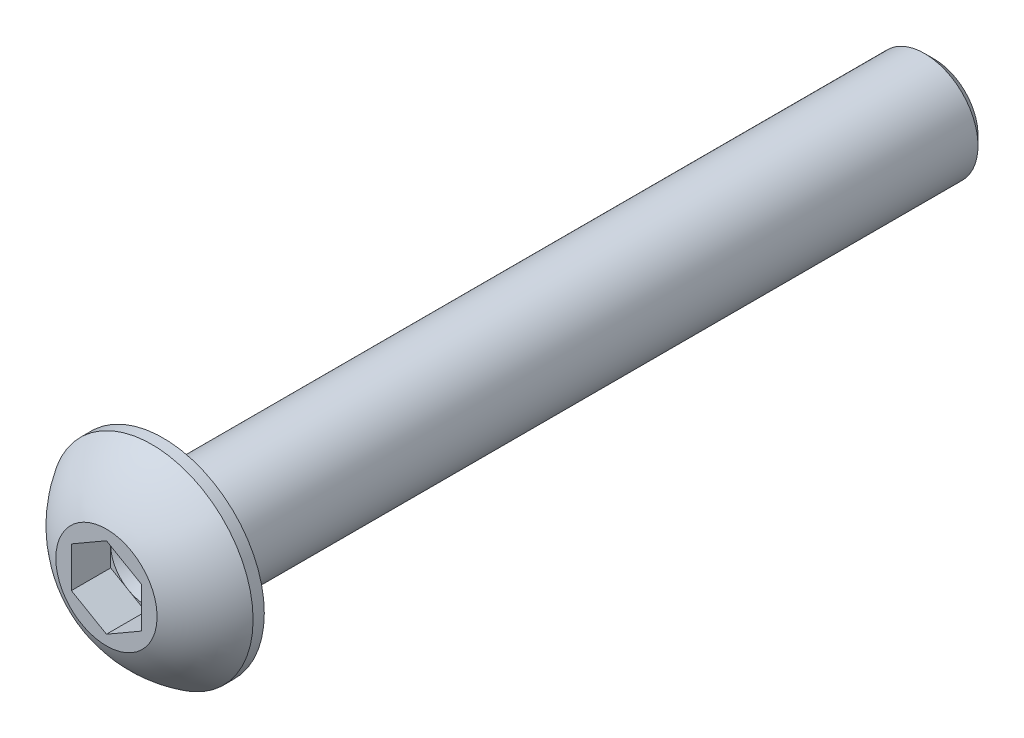
ISO-10303-21;
HEADER;
FILE_DESCRIPTION(('STEP AP214'),'2;1');
FILE_NAME('part.step','',(''),(''),'','','');
FILE_SCHEMA(('AUTOMOTIVE_DESIGN { 1 0 10303 214 1 1 1 1 }'));
ENDSEC;
DATA;
#1=APPLICATION_CONTEXT('core data for automotive mechanical design processes');
#2=APPLICATION_PROTOCOL_DEFINITION('international standard','automotive_design',2000,#1);
#3=PRODUCT_CONTEXT('',#1,'mechanical');
#4=PRODUCT('Part','Part','',(#3));
#5=PRODUCT_RELATED_PRODUCT_CATEGORY('part','',(#4));
#6=PRODUCT_DEFINITION_FORMATION('','',#4);
#7=PRODUCT_DEFINITION_CONTEXT('part definition',#1,'design');
#8=PRODUCT_DEFINITION('design','',#6,#7);
#9=PRODUCT_DEFINITION_SHAPE('','',#8);
#10=(LENGTH_UNIT() NAMED_UNIT(*) SI_UNIT(.MILLI.,.METRE.));
#11=(NAMED_UNIT(*) PLANE_ANGLE_UNIT() SI_UNIT($,.RADIAN.));
#12=(NAMED_UNIT(*) SI_UNIT($,.STERADIAN.) SOLID_ANGLE_UNIT());
#13=UNCERTAINTY_MEASURE_WITH_UNIT(LENGTH_MEASURE(1.E-05),#10,'distance_accuracy_value','');
#14=(GEOMETRIC_REPRESENTATION_CONTEXT(3) GLOBAL_UNCERTAINTY_ASSIGNED_CONTEXT((#13)) GLOBAL_UNIT_ASSIGNED_CONTEXT((#10,
#11,#12)) REPRESENTATION_CONTEXT('',''));
#15=CARTESIAN_POINT('',(0.,0.,0.));
#16=DIRECTION('',(0.,0.,1.));
#17=DIRECTION('',(1.,0.,0.));
#18=AXIS2_PLACEMENT_3D('',#15,#16,#17);
#19=CARTESIAN_POINT('',(0.,0.,-1.778));
#20=DIRECTION('',(0.,0.,1.));
#21=DIRECTION('',(1.,0.,0.));
#22=AXIS2_PLACEMENT_3D('',#19,#20,#21);
#23=PLANE('',#22);
#24=CARTESIAN_POINT('',(0.,0.,-1.778));
#25=DIRECTION('',(0.,0.,1.));
#26=DIRECTION('',(1.,0.,0.));
#27=AXIS2_PLACEMENT_3D('',#24,#25,#26);
#28=CIRCLE('',#27,1.5875);
#29=CARTESIAN_POINT('',(1.5875,0.,-1.778));
#30=VERTEX_POINT('',#29);
#31=CARTESIAN_POINT('',(0.79375,1.3748153285078,-1.778));
#32=VERTEX_POINT('',#31);
#33=EDGE_CURVE('E96',#30,#32,#28,.T.);
#34=ORIENTED_EDGE('',*,*,#33,.F.);
#35=DIRECTION('',(0.,-1.,0.));
#36=VECTOR('',#35,1.);
#37=CARTESIAN_POINT('',(1.5875,0.,-1.778));
#38=LINE('',#37,#36);
#39=CARTESIAN_POINT('',(1.5875,0.916543552338531,-1.778));
#40=VERTEX_POINT('',#39);
#41=EDGE_CURVE('E120',#40,#30,#38,.T.);
#42=ORIENTED_EDGE('',*,*,#41,.F.);
#43=DIRECTION('',(0.866025403784438,-0.5,0.));
#44=VECTOR('',#43,1.);
#45=CARTESIAN_POINT('',(0.79375,1.3748153285078,-1.778));
#46=LINE('',#45,#44);
#47=EDGE_CURVE('E118',#32,#40,#46,.T.);
#48=ORIENTED_EDGE('',*,*,#47,.F.);
#49=EDGE_LOOP('',(#34,#42,#48));
#50=FACE_BOUND('',#49,.T.);
#51=ADVANCED_FACE('F17',(#50),#23,.T.);
#52=CARTESIAN_POINT('',(-0.79375,1.37481532850779,-1.778));
#53=VERTEX_POINT('',#52);
#54=EDGE_CURVE('E98',#32,#53,#28,.T.);
#55=ORIENTED_EDGE('',*,*,#54,.F.);
#56=CARTESIAN_POINT('',(0.,1.83308710467706,-1.778));
#57=VERTEX_POINT('',#56);
#58=EDGE_CURVE('E113',#57,#32,#46,.T.);
#59=ORIENTED_EDGE('',*,*,#58,.F.);
#60=DIRECTION('',(0.866025403784437,0.5,0.));
#61=VECTOR('',#60,1.);
#62=CARTESIAN_POINT('',(-0.79375,1.37481532850779,-1.778));
#63=LINE('',#62,#61);
#64=EDGE_CURVE('E114',#53,#57,#63,.T.);
#65=ORIENTED_EDGE('',*,*,#64,.F.);
#66=EDGE_LOOP('',(#55,#59,#65));
#67=FACE_BOUND('',#66,.T.);
#68=ADVANCED_FACE('F111',(#67),#23,.T.);
#69=CARTESIAN_POINT('',(-1.5875,0.,-1.778));
#70=VERTEX_POINT('',#69);
#71=EDGE_CURVE('E117',#53,#70,#28,.T.);
#72=ORIENTED_EDGE('',*,*,#71,.F.);
#73=CARTESIAN_POINT('',(-1.5875,0.916543552338527,-1.778));
#74=VERTEX_POINT('',#73);
#75=EDGE_CURVE('E135',#74,#53,#63,.T.);
#76=ORIENTED_EDGE('',*,*,#75,.F.);
#77=DIRECTION('',(0.,1.,0.));
#78=VECTOR('',#77,1.);
#79=CARTESIAN_POINT('',(-1.5875,0.,-1.778));
#80=LINE('',#79,#78);
#81=EDGE_CURVE('E138',#70,#74,#80,.T.);
#82=ORIENTED_EDGE('',*,*,#81,.F.);
#83=EDGE_LOOP('',(#72,#76,#82));
#84=FACE_BOUND('',#83,.T.);
#85=ADVANCED_FACE('F226',(#84),#23,.T.);
#86=CARTESIAN_POINT('',(-0.79375,-1.3748153285078,-1.778));
#87=VERTEX_POINT('',#86);
#88=EDGE_CURVE('E251',#70,#87,#28,.T.);
#89=ORIENTED_EDGE('',*,*,#88,.F.);
#90=CARTESIAN_POINT('',(-1.5875,-0.916543552338531,-1.778));
#91=VERTEX_POINT('',#90);
#92=EDGE_CURVE('E139',#91,#70,#80,.T.);
#93=ORIENTED_EDGE('',*,*,#92,.F.);
#94=DIRECTION('',(-0.866025403784438,0.5,0.));
#95=VECTOR('',#94,1.);
#96=CARTESIAN_POINT('',(-0.79375,-1.3748153285078,-1.778));
#97=LINE('',#96,#95);
#98=EDGE_CURVE('E143',#87,#91,#97,.T.);
#99=ORIENTED_EDGE('',*,*,#98,.F.);
#100=EDGE_LOOP('',(#89,#93,#99));
#101=FACE_BOUND('',#100,.T.);
#102=ADVANCED_FACE('F238',(#101),#23,.T.);
#103=CARTESIAN_POINT('',(0.79375,-1.37481532850779,-1.778));
#104=VERTEX_POINT('',#103);
#105=EDGE_CURVE('E33',#87,#104,#28,.T.);
#106=ORIENTED_EDGE('',*,*,#105,.F.);
#107=CARTESIAN_POINT('',(0.,-1.83308710467706,-1.778));
#108=VERTEX_POINT('',#107);
#109=EDGE_CURVE('E144',#108,#87,#97,.T.);
#110=ORIENTED_EDGE('',*,*,#109,.F.);
#111=DIRECTION('',(-0.866025403784437,-0.5,0.));
#112=VECTOR('',#111,1.);
#113=CARTESIAN_POINT('',(0.79375,-1.37481532850779,-1.778));
#114=LINE('',#113,#112);
#115=EDGE_CURVE('E148',#104,#108,#114,.T.);
#116=ORIENTED_EDGE('',*,*,#115,.F.);
#117=EDGE_LOOP('',(#106,#110,#116));
#118=FACE_BOUND('',#117,.T.);
#119=ADVANCED_FACE('F231',(#118),#23,.T.);
#120=CARTESIAN_POINT('',(-1.146175,0.,0.));
#121=DIRECTION('',(0.,0.,1.));
#122=DIRECTION('',(1.,0.,0.));
#123=AXIS2_PLACEMENT_3D('',#120,#121,#122);
#124=PLANE('',#123);
#125=CARTESIAN_POINT('',(0.,0.,0.));
#126=DIRECTION('',(0.,0.,-1.));
#127=DIRECTION('',(-1.,0.,0.));
#128=AXIS2_PLACEMENT_3D('',#125,#126,#127);
#129=CIRCLE('',#128,2.29235);
#130=CARTESIAN_POINT('',(-2.29235000000001,0.,0.));
#131=VERTEX_POINT('',#130);
#132=EDGE_CURVE('E196',#131,#131,#129,.T.);
#133=ORIENTED_EDGE('',*,*,#132,.F.);
#134=EDGE_LOOP('',(#133));
#135=FACE_BOUND('',#134,.T.);
#136=DIRECTION('',(0.866025403784437,0.5,0.));
#137=VECTOR('',#136,1.);
#138=CARTESIAN_POINT('',(-0.79375,1.37481532850779,0.));
#139=LINE('',#138,#137);
#140=CARTESIAN_POINT('',(-1.5875,0.916543552338527,0.));
#141=VERTEX_POINT('',#140);
#142=CARTESIAN_POINT('',(0.,1.83308710467706,0.));
#143=VERTEX_POINT('',#142);
#144=EDGE_CURVE('E160',#141,#143,#139,.T.);
#145=ORIENTED_EDGE('',*,*,#144,.T.);
#146=DIRECTION('',(0.866025403784438,-0.5,0.));
#147=VECTOR('',#146,1.);
#148=CARTESIAN_POINT('',(0.79375,1.3748153285078,0.));
#149=LINE('',#148,#147);
#150=CARTESIAN_POINT('',(1.5875,0.916543552338531,0.));
#151=VERTEX_POINT('',#150);
#152=EDGE_CURVE('E106',#143,#151,#149,.T.);
#153=ORIENTED_EDGE('',*,*,#152,.T.);
#154=DIRECTION('',(0.,-1.,0.));
#155=VECTOR('',#154,1.);
#156=CARTESIAN_POINT('',(1.5875,0.,0.));
#157=LINE('',#156,#155);
#158=CARTESIAN_POINT('',(1.5875,-0.916543552338531,0.));
#159=VERTEX_POINT('',#158);
#160=EDGE_CURVE('E124',#151,#159,#157,.T.);
#161=ORIENTED_EDGE('',*,*,#160,.T.);
#162=DIRECTION('',(-0.866025403784437,-0.5,0.));
#163=VECTOR('',#162,1.);
#164=CARTESIAN_POINT('',(0.79375,-1.37481532850779,0.));
#165=LINE('',#164,#163);
#166=CARTESIAN_POINT('',(0.,-1.83308710467706,0.));
#167=VERTEX_POINT('',#166);
#168=EDGE_CURVE('E41',#159,#167,#165,.T.);
#169=ORIENTED_EDGE('',*,*,#168,.T.);
#170=DIRECTION('',(-0.866025403784438,0.5,0.));
#171=VECTOR('',#170,1.);
#172=CARTESIAN_POINT('',(-0.79375,-1.3748153285078,0.));
#173=LINE('',#172,#171);
#174=CARTESIAN_POINT('',(-1.5875,-0.916543552338531,0.));
#175=VERTEX_POINT('',#174);
#176=EDGE_CURVE('E167',#167,#175,#173,.T.);
#177=ORIENTED_EDGE('',*,*,#176,.T.);
#178=DIRECTION('',(0.,1.,0.));
#179=VECTOR('',#178,1.);
#180=CARTESIAN_POINT('',(-1.5875,0.,0.));
#181=LINE('',#180,#179);
#182=EDGE_CURVE('E164',#175,#141,#181,.T.);
#183=ORIENTED_EDGE('',*,*,#182,.T.);
#184=EDGE_LOOP('',(#145,#153,#161,#169,#177,#183));
#185=FACE_BOUND('',#184,.T.);
#186=ADVANCED_FACE('F237',(#135,#185),#124,.T.);
#187=CARTESIAN_POINT('',(0.,0.,1.48381805047393));
#188=DIRECTION('',(0.,0.,-1.));
#189=DIRECTION('',(-1.,0.,0.));
#190=AXIS2_PLACEMENT_3D('',#187,#188,#189);
#191=CYLINDRICAL_SURFACE('',#190,4.5847);
#192=CARTESIAN_POINT('',(0.,0.,-2.0574));
#193=DIRECTION('',(0.,0.,-1.));
#194=DIRECTION('',(-1.,0.,0.));
#195=AXIS2_PLACEMENT_3D('',#192,#193,#194);
#196=CIRCLE('',#195,4.5847);
#197=CARTESIAN_POINT('',(-4.5847,0.,-2.0574));
#198=VERTEX_POINT('',#197);
#199=EDGE_CURVE('E192',#198,#198,#196,.T.);
#200=ORIENTED_EDGE('',*,*,#199,.T.);
#201=EDGE_LOOP('',(#200));
#202=FACE_BOUND('',#201,.T.);
#203=CARTESIAN_POINT('',(0.,0.,-2.5654));
#204=DIRECTION('',(0.,0.,-1.));
#205=DIRECTION('',(-1.,0.,0.));
#206=AXIS2_PLACEMENT_3D('',#203,#204,#205);
#207=CIRCLE('',#206,4.5847);
#208=CARTESIAN_POINT('',(-4.5847,0.,-2.5654));
#209=VERTEX_POINT('',#208);
#210=EDGE_CURVE('E208',#209,#209,#207,.T.);
#211=ORIENTED_EDGE('',*,*,#210,.F.);
#212=EDGE_LOOP('',(#211));
#213=FACE_BOUND('',#212,.T.);
#214=ADVANCED_FACE('F243',(#202,#213),#191,.T.);
#215=CARTESIAN_POINT('',(-3.68935,0.,-2.5654));
#216=DIRECTION('',(0.,0.,-1.));
#217=DIRECTION('',(-1.,0.,0.));
#218=AXIS2_PLACEMENT_3D('',#215,#216,#217);
#219=PLANE('',#218);
#220=ORIENTED_EDGE('',*,*,#210,.T.);
#221=EDGE_LOOP('',(#220));
#222=FACE_BOUND('',#221,.T.);
#223=CARTESIAN_POINT('',(0.,0.,-2.5654));
#224=DIRECTION('',(0.,0.,-1.));
#225=DIRECTION('',(-1.,0.,0.));
#226=AXIS2_PLACEMENT_3D('',#223,#224,#225);
#227=CIRCLE('',#226,2.794);
#228=CARTESIAN_POINT('',(-2.794,0.,-2.5654));
#229=VERTEX_POINT('',#228);
#230=EDGE_CURVE('E204',#229,#229,#227,.T.);
#231=ORIENTED_EDGE('',*,*,#230,.F.);
#232=EDGE_LOOP('',(#231));
#233=FACE_BOUND('',#232,.T.);
#234=ADVANCED_FACE('F303',(#222,#233),#219,.T.);
#235=CARTESIAN_POINT('',(0.,0.,-2.9464));
#236=DIRECTION('',(0.,0.,-1.));
#237=DIRECTION('',(-1.,0.,0.));
#238=AXIS2_PLACEMENT_3D('',#235,#236,#237);
#239=TOROIDAL_SURFACE('',#238,2.794,0.381);
#240=ORIENTED_EDGE('',*,*,#230,.T.);
#241=EDGE_LOOP('',(#240));
#242=FACE_BOUND('',#241,.T.);
#243=CARTESIAN_POINT('',(0.,0.,-2.9464));
#244=DIRECTION('',(0.,0.,-1.));
#245=DIRECTION('',(-1.,0.,0.));
#246=AXIS2_PLACEMENT_3D('',#243,#244,#245);
#247=CIRCLE('',#246,2.413);
#248=CARTESIAN_POINT('',(-2.413,0.,-2.9464));
#249=VERTEX_POINT('',#248);
#250=EDGE_CURVE('E200',#249,#249,#247,.T.);
#251=ORIENTED_EDGE('',*,*,#250,.F.);
#252=EDGE_LOOP('',(#251));
#253=FACE_BOUND('',#252,.T.);
#254=ADVANCED_FACE('F299',(#242,#253),#239,.F.);
#255=CARTESIAN_POINT('',(0.,0.,1.48381805047393));
#256=DIRECTION('',(0.,0.,-1.));
#257=DIRECTION('',(-1.,0.,0.));
#258=AXIS2_PLACEMENT_3D('',#255,#256,#257);
#259=CYLINDRICAL_SURFACE('',#258,2.413);
#260=CARTESIAN_POINT('',(0.,0.,-37.06145761938));
#261=DIRECTION('',(0.,0.,-1.));
#262=DIRECTION('',(-1.,0.,0.));
#263=AXIS2_PLACEMENT_3D('',#260,#261,#262);
#264=CIRCLE('',#263,2.413);
#265=CARTESIAN_POINT('',(-2.413,0.,-37.06145761938));
#266=VERTEX_POINT('',#265);
#267=EDGE_CURVE('E11',#266,#266,#264,.F.);
#268=ORIENTED_EDGE('',*,*,#267,.T.);
#269=EDGE_LOOP('',(#268));
#270=FACE_BOUND('',#269,.T.);
#271=ORIENTED_EDGE('',*,*,#250,.T.);
#272=EDGE_LOOP('',(#271));
#273=FACE_BOUND('',#272,.T.);
#274=ADVANCED_FACE('F296',(#270,#273),#259,.T.);
#275=CARTESIAN_POINT('',(-1.2065,0.,-37.4904));
#276=DIRECTION('',(0.,0.,-1.));
#277=DIRECTION('',(-1.,0.,0.));
#278=AXIS2_PLACEMENT_3D('',#275,#276,#277);
#279=PLANE('',#278);
#280=CARTESIAN_POINT('',(0.,0.,-37.4904));
#281=DIRECTION('',(0.,0.,-1.));
#282=DIRECTION('',(-1.,0.,0.));
#283=AXIS2_PLACEMENT_3D('',#280,#281,#282);
#284=CIRCLE('',#283,1.98405761938);
#285=CARTESIAN_POINT('',(-1.98405761938,0.,-37.4904));
#286=VERTEX_POINT('',#285);
#287=EDGE_CURVE('E26',#286,#286,#284,.T.);
#288=ORIENTED_EDGE('',*,*,#287,.T.);
#289=EDGE_LOOP('',(#288));
#290=FACE_BOUND('',#289,.T.);
#291=ADVANCED_FACE('F215',(#290),#279,.T.);
#292=CARTESIAN_POINT('',(0.,0.,-4.85989606481481));
#293=DIRECTION('',(0.,0.,-1.));
#294=DIRECTION('',(-1.,0.,0.));
#295=AXIS2_PLACEMENT_3D('',#292,#293,#294);
#296=SPHERICAL_SURFACE('',#295,5.37340285883187);
#297=CARTESIAN_POINT('',(-4.5847,0.,-2.0574));
#298=CARTESIAN_POINT('',(-4.56772775071365,0.,-2.02963444466225));
#299=CARTESIAN_POINT('',(-4.55050321576171,0.,-2.00202310563314));
#300=CARTESIAN_POINT('',(-4.51555538986232,0.,-1.94711789153313));
#301=CARTESIAN_POINT('',(-4.49783209891487,0.,-1.91982401646224));
#302=CARTESIAN_POINT('',(-4.4618925763601,0.,-1.8655627616196));
#303=CARTESIAN_POINT('',(-4.44367634475278,0.,-1.83859538184787));
#304=CARTESIAN_POINT('',(-4.40675696303686,0.,-1.78499601309644));
#305=CARTESIAN_POINT('',(-4.38805381292827,0.,-1.75836402411674));
#306=CARTESIAN_POINT('',(-4.35016676527117,0.,-1.70544422925954));
#307=CARTESIAN_POINT('',(-4.33098286772266,0.,-1.67915642338203));
#308=CARTESIAN_POINT('',(-4.29214065809995,0.,-1.62693367141508));
#309=CARTESIAN_POINT('',(-4.27248234602574,0.,-1.60099872532564));
#310=CARTESIAN_POINT('',(-4.23269779601254,0.,-1.54949025368841));
#311=CARTESIAN_POINT('',(-4.21257155807355,0.,-1.52391672814064));
#312=CARTESIAN_POINT('',(-4.17185779967265,0.,-1.4731395388975));
#313=CARTESIAN_POINT('',(-4.15127027921075,0.,-1.44793587520214));
#314=CARTESIAN_POINT('',(-4.10964075130566,0.,-1.39790672892889));
#315=CARTESIAN_POINT('',(-4.08859874386249,0.,-1.37308124635099));
#316=CARTESIAN_POINT('',(-4.04606718757048,0.,-1.32381665673685));
#317=CARTESIAN_POINT('',(-4.02457763872164,0.,-1.29937754970059));
#318=CARTESIAN_POINT('',(-3.98115809291457,0.,-1.25089377806135));
#319=CARTESIAN_POINT('',(-3.95922809595633,0.,-1.22684911345837));
#320=CARTESIAN_POINT('',(-3.91493489261154,0.,-1.1791621633785));
#321=CARTESIAN_POINT('',(-3.892571686225,0.,-1.15551987790161));
#322=CARTESIAN_POINT('',(-3.84741944569869,0.,-1.10864548994917));
#323=CARTESIAN_POINT('',(-3.82463041155893,0.,-1.08541338747362));
#324=CARTESIAN_POINT('',(-3.77863403775912,0.,-1.03936703400529));
#325=CARTESIAN_POINT('',(-3.75542669809908,0.,-1.01655278301252));
#326=CARTESIAN_POINT('',(-3.70860137356642,0.,-0.971349663066289));
#327=CARTESIAN_POINT('',(-3.68498338869382,0.,-0.94896079411283));
#328=CARTESIAN_POINT('',(-3.63734456959005,0.,-0.904615828391113));
#329=CARTESIAN_POINT('',(-3.61332373535889,0.,-0.882659731622856));
#330=CARTESIAN_POINT('',(-3.56488714636506,0.,-0.839187557567447));
#331=CARTESIAN_POINT('',(-3.54047139160238,0.,-0.817671480280295));
#332=CARTESIAN_POINT('',(-3.4912530207284,0.,-0.775086447240822));
#333=CARTESIAN_POINT('',(-3.4664504046171,0.,-0.754017491488501));
#334=CARTESIAN_POINT('',(-3.41646649792444,0.,-0.712333655985979));
#335=CARTESIAN_POINT('',(-3.39128520734309,0.,-0.691718776235777));
#336=CARTESIAN_POINT('',(-3.34055226358225,0.,-0.650949897322802));
#337=CARTESIAN_POINT('',(-3.31500061040276,0.,-0.630795898160027));
#338=CARTESIAN_POINT('',(-3.26353537556731,0.,-0.590955432879197));
#339=CARTESIAN_POINT('',(-3.23762179391134,0.,-0.57126896676114));
#340=CARTESIAN_POINT('',(-3.18544125571044,0.,-0.532370065703055));
#341=CARTESIAN_POINT('',(-3.15917429916551,0.,-0.513157630763025));
#342=CARTESIAN_POINT('',(-3.10629568141643,0.,-0.475213133725829));
#343=CARTESIAN_POINT('',(-3.07968402021229,0.,-0.456481071628663));
#344=CARTESIAN_POINT('',(-3.02612477715573,0.,-0.419503503378719));
#345=CARTESIAN_POINT('',(-2.99917719530331,0.,-0.40125799722594));
#346=CARTESIAN_POINT('',(-2.94495500583993,0.,-0.365259563367945));
#347=CARTESIAN_POINT('',(-2.91768039822897,0.,-0.347506635662729));
#348=CARTESIAN_POINT('',(-2.8628131600919,0.,-0.312499218594777));
#349=CARTESIAN_POINT('',(-2.83522052956579,0.,-0.295244729232041));
#350=CARTESIAN_POINT('',(-2.77972635338319,0.,-0.261239884283562));
#351=CARTESIAN_POINT('',(-2.75182480772671,0.,-0.244489528697819));
#352=CARTESIAN_POINT('',(-2.69572201115466,0.,-0.211498480091079));
#353=CARTESIAN_POINT('',(-2.6675207602391,0.,-0.195257787070081));
#354=CARTESIAN_POINT('',(-2.61082786150165,0.,-0.163291425052401));
#355=CARTESIAN_POINT('',(-2.58233621367977,0.,-0.147565756055718));
#356=CARTESIAN_POINT('',(-2.52507192700006,0.,-0.116634630180611));
#357=CARTESIAN_POINT('',(-2.49629928814224,0.,-0.101429173302187));
#358=CARTESIAN_POINT('',(-2.43848251180434,0.,-0.0715435006068001));
#359=CARTESIAN_POINT('',(-2.40943837432427,0.,-0.0568632847898376));
#360=CARTESIAN_POINT('',(-2.35108820593536,0.,-0.0280329029080984));
#361=CARTESIAN_POINT('',(-2.32178217502651,0.,-0.0138827368433216));
#362=CARTESIAN_POINT('',(-2.29235000000001,0.,0.));
#363=B_SPLINE_CURVE_WITH_KNOTS('',3,(#297,#298,#299,#300,#301,#302,#303,#304,#305,#306,#307,
#308,#309,#310,#311,#312,#313,#314,#315,#316,#317,#318,#319,#320,#321,#322,#323,#324,#325,#326,
#327,#328,#329,#330,#331,#332,#333,#334,#335,#336,#337,#338,#339,#340,#341,#342,#343,#344,#345,
#346,#347,#348,#349,#350,#351,#352,#353,#354,#355,#356,#357,#358,#359,#360,#361,#362),
.UNSPECIFIED.,.F.,.F.,(4,2,2,2,2,2,2,2,2,2,2,2,2,2,2,2,2,2,2,2,2,2,2,2,2,2,2,2,2,2,2,2,4),(0.,
0.09762472664678,0.195249453293559,0.292874179940339,0.390498906587117,0.488123633233897,
0.585748359880676,0.683373086527455,0.780997813174235,0.878622539821013,0.976247266467793,
1.07387199311457,1.17149671976135,1.26912144640813,1.36674617305491,1.46437089970169,
1.56199562634847,1.65962035299525,1.75724507964203,1.85486980628881,1.95249453293559,
2.05011925958237,2.14774398622914,2.24536871287592,2.3429934395227,2.44061816616948,
2.53824289281626,2.63586761946304,2.73349234610982,2.8311170727566,2.92874179940338,
3.02636652605016,3.12399125269694),.UNSPECIFIED.);
#364=EDGE_CURVE('BSEAM287',#198,#131,#363,.T.);
#365=ORIENTED_EDGE('',*,*,#199,.F.);
#366=ORIENTED_EDGE('',*,*,#132,.T.);
#367=ORIENTED_EDGE('',*,*,#364,.T.);
#368=ORIENTED_EDGE('',*,*,#364,.F.);
#369=EDGE_LOOP('',(#365,#367,#366,#368));
#370=FACE_BOUND('',#369,.T.);
#371=ADVANCED_FACE('F287',(#370),#296,.T.);
#372=CARTESIAN_POINT('',(0.79375,1.3748153285078,-1.778));
#373=DIRECTION('',(-0.5,-0.866025403784438,0.));
#374=DIRECTION('',(0.866025403784438,-0.5,0.));
#375=AXIS2_PLACEMENT_3D('',#372,#373,#374);
#376=PLANE('',#375);
#377=ORIENTED_EDGE('',*,*,#152,.F.);
#378=DIRECTION('',(0.,0.,1.));
#379=VECTOR('',#378,1.);
#380=CARTESIAN_POINT('',(0.,1.83308710467706,-1.778));
#381=LINE('',#380,#379);
#382=EDGE_CURVE('E129',#57,#143,#381,.T.);
#383=ORIENTED_EDGE('',*,*,#382,.F.);
#384=ORIENTED_EDGE('',*,*,#58,.T.);
#385=ORIENTED_EDGE('',*,*,#47,.T.);
#386=DIRECTION('',(0.,0.,1.));
#387=VECTOR('',#386,1.);
#388=CARTESIAN_POINT('',(1.5875,0.916543552338531,-1.778));
#389=LINE('',#388,#387);
#390=EDGE_CURVE('E156',#40,#151,#389,.T.);
#391=ORIENTED_EDGE('',*,*,#390,.T.);
#392=EDGE_LOOP('',(#377,#383,#384,#385,#391));
#393=FACE_BOUND('',#392,.T.);
#394=ADVANCED_FACE('F128',(#393),#376,.T.);
#395=CARTESIAN_POINT('',(-0.79375,1.37481532850779,-1.778));
#396=DIRECTION('',(0.5,-0.866025403784437,0.));
#397=DIRECTION('',(0.866025403784437,0.5,0.));
#398=AXIS2_PLACEMENT_3D('',#395,#396,#397);
#399=PLANE('',#398);
#400=ORIENTED_EDGE('',*,*,#144,.F.);
#401=DIRECTION('',(0.,0.,1.));
#402=VECTOR('',#401,1.);
#403=CARTESIAN_POINT('',(-1.5875,0.916543552338527,-1.778));
#404=LINE('',#403,#402);
#405=EDGE_CURVE('E187',#74,#141,#404,.T.);
#406=ORIENTED_EDGE('',*,*,#405,.F.);
#407=ORIENTED_EDGE('',*,*,#75,.T.);
#408=ORIENTED_EDGE('',*,*,#64,.T.);
#409=ORIENTED_EDGE('',*,*,#382,.T.);
#410=EDGE_LOOP('',(#400,#406,#407,#408,#409));
#411=FACE_BOUND('',#410,.T.);
#412=ADVANCED_FACE('F280',(#411),#399,.T.);
#413=CARTESIAN_POINT('',(-1.5875,0.,-1.778));
#414=DIRECTION('',(1.,0.,0.));
#415=DIRECTION('',(0.,0.,-1.));
#416=AXIS2_PLACEMENT_3D('',#413,#414,#415);
#417=PLANE('',#416);
#418=ORIENTED_EDGE('',*,*,#182,.F.);
#419=DIRECTION('',(0.,0.,1.));
#420=VECTOR('',#419,1.);
#421=CARTESIAN_POINT('',(-1.5875,-0.916543552338531,-1.778));
#422=LINE('',#421,#420);
#423=EDGE_CURVE('E184',#91,#175,#422,.T.);
#424=ORIENTED_EDGE('',*,*,#423,.F.);
#425=ORIENTED_EDGE('',*,*,#92,.T.);
#426=ORIENTED_EDGE('',*,*,#81,.T.);
#427=ORIENTED_EDGE('',*,*,#405,.T.);
#428=EDGE_LOOP('',(#418,#424,#425,#426,#427));
#429=FACE_BOUND('',#428,.T.);
#430=ADVANCED_FACE('F273',(#429),#417,.T.);
#431=CARTESIAN_POINT('',(-0.79375,-1.3748153285078,-1.778));
#432=DIRECTION('',(0.5,0.866025403784438,0.));
#433=DIRECTION('',(-0.866025403784438,0.5,0.));
#434=AXIS2_PLACEMENT_3D('',#431,#432,#433);
#435=PLANE('',#434);
#436=ORIENTED_EDGE('',*,*,#176,.F.);
#437=DIRECTION('',(0.,0.,1.));
#438=VECTOR('',#437,1.);
#439=CARTESIAN_POINT('',(0.,-1.83308710467706,-1.778));
#440=LINE('',#439,#438);
#441=EDGE_CURVE('E181',#108,#167,#440,.T.);
#442=ORIENTED_EDGE('',*,*,#441,.F.);
#443=ORIENTED_EDGE('',*,*,#109,.T.);
#444=ORIENTED_EDGE('',*,*,#98,.T.);
#445=ORIENTED_EDGE('',*,*,#423,.T.);
#446=EDGE_LOOP('',(#436,#442,#443,#444,#445));
#447=FACE_BOUND('',#446,.T.);
#448=ADVANCED_FACE('F260',(#447),#435,.T.);
#449=CARTESIAN_POINT('',(0.79375,-1.37481532850779,-1.778));
#450=DIRECTION('',(-0.5,0.866025403784437,0.));
#451=DIRECTION('',(-0.866025403784437,-0.5,0.));
#452=AXIS2_PLACEMENT_3D('',#449,#450,#451);
#453=PLANE('',#452);
#454=ORIENTED_EDGE('',*,*,#168,.F.);
#455=DIRECTION('',(0.,0.,1.));
#456=VECTOR('',#455,1.);
#457=CARTESIAN_POINT('',(1.5875,-0.916543552338531,-1.778));
#458=LINE('',#457,#456);
#459=CARTESIAN_POINT('',(1.5875,-0.916543552338531,-1.778));
#460=VERTEX_POINT('',#459);
#461=EDGE_CURVE('E178',#460,#159,#458,.T.);
#462=ORIENTED_EDGE('',*,*,#461,.F.);
#463=EDGE_CURVE('E149',#460,#104,#114,.T.);
#464=ORIENTED_EDGE('',*,*,#463,.T.);
#465=ORIENTED_EDGE('',*,*,#115,.T.);
#466=ORIENTED_EDGE('',*,*,#441,.T.);
#467=EDGE_LOOP('',(#454,#462,#464,#465,#466));
#468=FACE_BOUND('',#467,.T.);
#469=ADVANCED_FACE('F234',(#468),#453,.T.);
#470=CARTESIAN_POINT('',(1.5875,0.,-1.778));
#471=DIRECTION('',(-1.,0.,0.));
#472=DIRECTION('',(0.,0.,1.));
#473=AXIS2_PLACEMENT_3D('',#470,#471,#472);
#474=PLANE('',#473);
#475=ORIENTED_EDGE('',*,*,#160,.F.);
#476=ORIENTED_EDGE('',*,*,#390,.F.);
#477=ORIENTED_EDGE('',*,*,#41,.T.);
#478=EDGE_CURVE('E153',#30,#460,#38,.T.);
#479=ORIENTED_EDGE('',*,*,#478,.T.);
#480=ORIENTED_EDGE('',*,*,#461,.T.);
#481=EDGE_LOOP('',(#475,#476,#477,#479,#480));
#482=FACE_BOUND('',#481,.T.);
#483=ADVANCED_FACE('F229',(#482),#474,.T.);
#484=EDGE_CURVE('E100',#104,#30,#28,.T.);
#485=ORIENTED_EDGE('',*,*,#484,.F.);
#486=ORIENTED_EDGE('',*,*,#463,.F.);
#487=ORIENTED_EDGE('',*,*,#478,.F.);
#488=EDGE_LOOP('',(#485,#486,#487));
#489=FACE_BOUND('',#488,.T.);
#490=ADVANCED_FACE('F93',(#489),#23,.T.);
#491=CARTESIAN_POINT('',(0.,0.,-1.778));
#492=DIRECTION('',(0.,0.,1.));
#493=DIRECTION('',(1.,0.,0.));
#494=AXIS2_PLACEMENT_3D('',#491,#492,#493);
#495=CONICAL_SURFACE('',#494,1.5875,1.0471975511966);
#496=CARTESIAN_POINT('',(0.,0.,-2.69454355233854));
#497=VERTEX_POINT('',#496);
#498=VERTEX_LOOP('',#497);
#499=FACE_BOUND('',#498,.T.);
#500=ORIENTED_EDGE('',*,*,#33,.T.);
#501=ORIENTED_EDGE('',*,*,#54,.T.);
#502=ORIENTED_EDGE('',*,*,#71,.T.);
#503=ORIENTED_EDGE('',*,*,#88,.T.);
#504=ORIENTED_EDGE('',*,*,#105,.T.);
#505=ORIENTED_EDGE('',*,*,#484,.T.);
#506=EDGE_LOOP('',(#500,#501,#502,#503,#504,#505));
#507=FACE_BOUND('',#506,.T.);
#508=ADVANCED_FACE('F91',(#499,#507),#495,.F.);
#509=CARTESIAN_POINT('',(0.,0.,-37.4904));
#510=DIRECTION('',(0.,0.,1.));
#511=DIRECTION('',(1.,0.,0.));
#512=AXIS2_PLACEMENT_3D('',#509,#510,#511);
#513=CONICAL_SURFACE('',#512,1.98405761938,0.785398163397445);
#514=ORIENTED_EDGE('',*,*,#267,.F.);
#515=EDGE_LOOP('',(#514));
#516=FACE_BOUND('',#515,.T.);
#517=ORIENTED_EDGE('',*,*,#287,.F.);
#518=EDGE_LOOP('',(#517));
#519=FACE_BOUND('',#518,.T.);
#520=ADVANCED_FACE('F19',(#516,#519),#513,.T.);
#521=CLOSED_SHELL('',(#51,#68,#85,#102,#119,#186,#214,#234,#254,#274,#291,#371,#394,#412,#430,
#448,#469,#483,#490,#508,#520));
#522=MANIFOLD_SOLID_BREP('B1',#521);
#523=ADVANCED_BREP_SHAPE_REPRESENTATION('',(#18,#522),#14);
#524=SHAPE_DEFINITION_REPRESENTATION(#9,#523);
ENDSEC;
END-ISO-10303-21;
